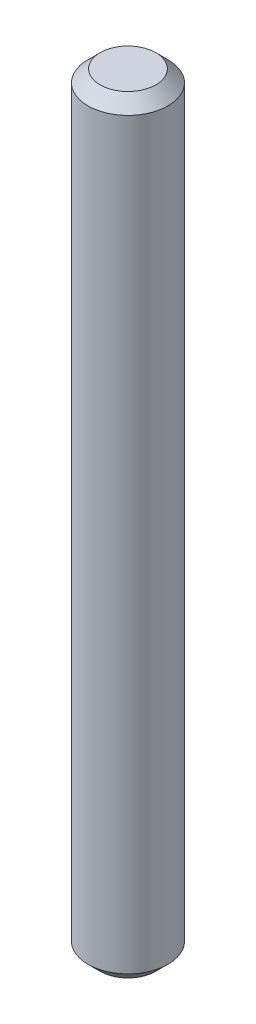
ISO-10303-21;
HEADER;
FILE_DESCRIPTION(('STEP AP214'),'2;1');
FILE_NAME('part.step','',(''),(''),'','','');
FILE_SCHEMA(('AUTOMOTIVE_DESIGN { 1 0 10303 214 1 1 1 1 }'));
ENDSEC;
DATA;
#1=APPLICATION_CONTEXT('core data for automotive mechanical design processes');
#2=APPLICATION_PROTOCOL_DEFINITION('international standard','automotive_design',2000,#1);
#3=PRODUCT_CONTEXT('',#1,'mechanical');
#4=PRODUCT('Part','Part','',(#3));
#5=PRODUCT_RELATED_PRODUCT_CATEGORY('part','',(#4));
#6=PRODUCT_DEFINITION_FORMATION('','',#4);
#7=PRODUCT_DEFINITION_CONTEXT('part definition',#1,'design');
#8=PRODUCT_DEFINITION('design','',#6,#7);
#9=PRODUCT_DEFINITION_SHAPE('','',#8);
#10=(LENGTH_UNIT() NAMED_UNIT(*) SI_UNIT(.MILLI.,.METRE.));
#11=(NAMED_UNIT(*) PLANE_ANGLE_UNIT() SI_UNIT($,.RADIAN.));
#12=(NAMED_UNIT(*) SI_UNIT($,.STERADIAN.) SOLID_ANGLE_UNIT());
#13=UNCERTAINTY_MEASURE_WITH_UNIT(LENGTH_MEASURE(1.E-05),#10,'distance_accuracy_value','');
#14=(GEOMETRIC_REPRESENTATION_CONTEXT(3) GLOBAL_UNCERTAINTY_ASSIGNED_CONTEXT((#13)) GLOBAL_UNIT_ASSIGNED_CONTEXT((#10,
#11,#12)) REPRESENTATION_CONTEXT('',''));
#15=CARTESIAN_POINT('',(0.,0.,0.));
#16=DIRECTION('',(0.,0.,1.));
#17=DIRECTION('',(1.,0.,0.));
#18=AXIS2_PLACEMENT_3D('',#15,#16,#17);
#19=CARTESIAN_POINT('',(0.,190.,0.));
#20=DIRECTION('',(0.,-1.,0.));
#21=DIRECTION('',(0.,0.,-1.));
#22=AXIS2_PLACEMENT_3D('',#19,#20,#21);
#23=CYLINDRICAL_SURFACE('',#22,9.9);
#24=CARTESIAN_POINT('',(0.,3.00000000000003,0.));
#25=DIRECTION('',(0.,1.,0.));
#26=DIRECTION('',(0.,0.,1.));
#27=AXIS2_PLACEMENT_3D('',#24,#25,#26);
#28=CIRCLE('',#27,9.9);
#29=CARTESIAN_POINT('',(0.,3.00000000000003,9.9));
#30=VERTEX_POINT('',#29);
#31=EDGE_CURVE('E59',#30,#30,#28,.T.);
#32=ORIENTED_EDGE('',*,*,#31,.T.);
#33=EDGE_LOOP('',(#32));
#34=FACE_BOUND('',#33,.T.);
#35=CARTESIAN_POINT('',(0.,187.,0.));
#36=DIRECTION('',(0.,1.,0.));
#37=DIRECTION('',(0.,0.,1.));
#38=AXIS2_PLACEMENT_3D('',#35,#36,#37);
#39=CIRCLE('',#38,9.9);
#40=CARTESIAN_POINT('',(0.,187.,9.9));
#41=VERTEX_POINT('',#40);
#42=EDGE_CURVE('E64',#41,#41,#39,.F.);
#43=ORIENTED_EDGE('',*,*,#42,.T.);
#44=EDGE_LOOP('',(#43));
#45=FACE_BOUND('',#44,.T.);
#46=ADVANCED_FACE('F45',(#34,#45),#23,.T.);
#47=CARTESIAN_POINT('',(0.,190.,0.));
#48=DIRECTION('',(0.,1.,0.));
#49=DIRECTION('',(0.,0.,1.));
#50=AXIS2_PLACEMENT_3D('',#47,#48,#49);
#51=PLANE('',#50);
#52=CARTESIAN_POINT('',(0.,190.,0.));
#53=DIRECTION('',(0.,1.,0.));
#54=DIRECTION('',(0.,0.,1.));
#55=AXIS2_PLACEMENT_3D('',#52,#53,#54);
#56=CIRCLE('',#55,6.90000000000002);
#57=CARTESIAN_POINT('',(0.,190.,6.90000000000002));
#58=VERTEX_POINT('',#57);
#59=EDGE_CURVE('E10',#58,#58,#56,.T.);
#60=ORIENTED_EDGE('',*,*,#59,.T.);
#61=EDGE_LOOP('',(#60));
#62=FACE_BOUND('',#61,.T.);
#63=ADVANCED_FACE('F81',(#62),#51,.T.);
#64=CARTESIAN_POINT('',(0.,0.,0.));
#65=DIRECTION('',(0.,1.,0.));
#66=DIRECTION('',(0.,0.,1.));
#67=AXIS2_PLACEMENT_3D('',#64,#65,#66);
#68=PLANE('',#67);
#69=CARTESIAN_POINT('',(0.,0.,0.));
#70=DIRECTION('',(0.,1.,0.));
#71=DIRECTION('',(0.,0.,1.));
#72=AXIS2_PLACEMENT_3D('',#69,#70,#71);
#73=CIRCLE('',#72,6.89999999999993);
#74=CARTESIAN_POINT('',(0.,0.,6.89999999999993));
#75=VERTEX_POINT('',#74);
#76=EDGE_CURVE('E54',#75,#75,#73,.F.);
#77=ORIENTED_EDGE('',*,*,#76,.T.);
#78=EDGE_LOOP('',(#77));
#79=FACE_BOUND('',#78,.T.);
#80=ADVANCED_FACE('F78',(#79),#68,.F.);
#81=CARTESIAN_POINT('',(0.,3.00000000000003,0.));
#82=DIRECTION('',(0.,1.,0.));
#83=DIRECTION('',(0.,0.,1.));
#84=AXIS2_PLACEMENT_3D('',#81,#82,#83);
#85=CONICAL_SURFACE('',#84,9.9,0.785398163397454);
#86=ORIENTED_EDGE('',*,*,#76,.F.);
#87=EDGE_LOOP('',(#86));
#88=FACE_BOUND('',#87,.T.);
#89=ORIENTED_EDGE('',*,*,#31,.F.);
#90=EDGE_LOOP('',(#89));
#91=FACE_BOUND('',#90,.T.);
#92=ADVANCED_FACE('F74',(#88,#91),#85,.T.);
#93=CARTESIAN_POINT('',(0.,190.,0.));
#94=DIRECTION('',(0.,-1.,0.));
#95=DIRECTION('',(0.,0.,-1.));
#96=AXIS2_PLACEMENT_3D('',#93,#94,#95);
#97=CONICAL_SURFACE('',#96,6.90000000000002,0.785398163397445);
#98=ORIENTED_EDGE('',*,*,#42,.F.);
#99=EDGE_LOOP('',(#98));
#100=FACE_BOUND('',#99,.T.);
#101=ORIENTED_EDGE('',*,*,#59,.F.);
#102=EDGE_LOOP('',(#101));
#103=FACE_BOUND('',#102,.T.);
#104=ADVANCED_FACE('F48',(#100,#103),#97,.T.);
#105=CLOSED_SHELL('',(#46,#63,#80,#92,#104));
#106=MANIFOLD_SOLID_BREP('B2',#105);
#107=ADVANCED_BREP_SHAPE_REPRESENTATION('',(#18,#106),#14);
#108=SHAPE_DEFINITION_REPRESENTATION(#9,#107);
ENDSEC;
END-ISO-10303-21;
